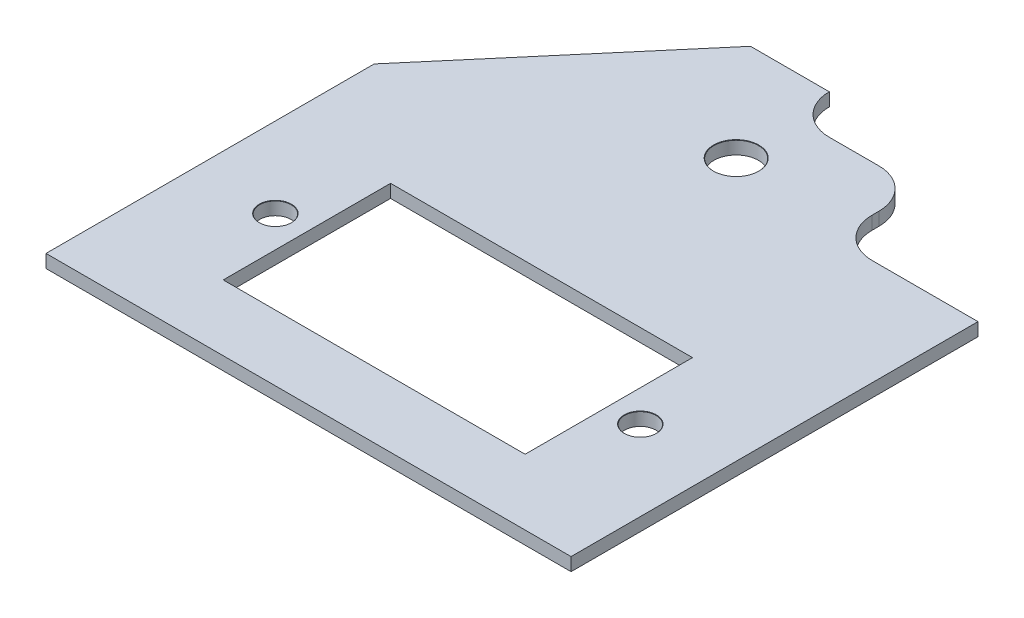
ISO-10303-21;
HEADER;
FILE_DESCRIPTION(('STEP AP214'),'2;1');
FILE_NAME('part.step','',(''),(''),'','','');
FILE_SCHEMA(('AUTOMOTIVE_DESIGN { 1 0 10303 214 1 1 1 1 }'));
ENDSEC;
DATA;
#1=APPLICATION_CONTEXT('core data for automotive mechanical design processes');
#2=APPLICATION_PROTOCOL_DEFINITION('international standard','automotive_design',2000,#1);
#3=PRODUCT_CONTEXT('',#1,'mechanical');
#4=PRODUCT('Part','Part','',(#3));
#5=PRODUCT_RELATED_PRODUCT_CATEGORY('part','',(#4));
#6=PRODUCT_DEFINITION_FORMATION('','',#4);
#7=PRODUCT_DEFINITION_CONTEXT('part definition',#1,'design');
#8=PRODUCT_DEFINITION('design','',#6,#7);
#9=PRODUCT_DEFINITION_SHAPE('','',#8);
#10=(LENGTH_UNIT() NAMED_UNIT(*) SI_UNIT(.MILLI.,.METRE.));
#11=(NAMED_UNIT(*) PLANE_ANGLE_UNIT() SI_UNIT($,.RADIAN.));
#12=(NAMED_UNIT(*) SI_UNIT($,.STERADIAN.) SOLID_ANGLE_UNIT());
#13=UNCERTAINTY_MEASURE_WITH_UNIT(LENGTH_MEASURE(1.E-05),#10,'distance_accuracy_value','');
#14=(GEOMETRIC_REPRESENTATION_CONTEXT(3) GLOBAL_UNCERTAINTY_ASSIGNED_CONTEXT((#13)) GLOBAL_UNIT_ASSIGNED_CONTEXT((#10,
#11,#12)) REPRESENTATION_CONTEXT('',''));
#15=CARTESIAN_POINT('',(0.,0.,0.));
#16=DIRECTION('',(0.,0.,1.));
#17=DIRECTION('',(1.,0.,0.));
#18=AXIS2_PLACEMENT_3D('',#15,#16,#17);
#19=CARTESIAN_POINT('',(9.77,1.,6.5));
#20=DIRECTION('',(0.,1.,0.));
#21=DIRECTION('',(0.,0.,1.));
#22=AXIS2_PLACEMENT_3D('',#19,#20,#21);
#23=PLANE('',#22);
#24=CARTESIAN_POINT('',(-16.0713203435596,1.,29.125));
#25=DIRECTION('',(0.,1.,0.));
#26=DIRECTION('',(0.,0.,1.));
#27=AXIS2_PLACEMENT_3D('',#24,#25,#26);
#28=CIRCLE('',#27,1.225);
#29=CARTESIAN_POINT('',(-16.0713203435596,1.,30.35));
#30=VERTEX_POINT('',#29);
#31=EDGE_CURVE('E430',#30,#30,#28,.T.);
#32=ORIENTED_EDGE('',*,*,#31,.F.);
#33=EDGE_LOOP('',(#32));
#34=FACE_BOUND('',#33,.T.);
#35=CARTESIAN_POINT('',(11.7286796564404,1.,29.125));
#36=DIRECTION('',(0.,1.,0.));
#37=DIRECTION('',(0.,0.,1.));
#38=AXIS2_PLACEMENT_3D('',#35,#36,#37);
#39=CIRCLE('',#38,1.225);
#40=CARTESIAN_POINT('',(11.7286796564404,1.,30.35));
#41=VERTEX_POINT('',#40);
#42=EDGE_CURVE('E418',#41,#41,#39,.T.);
#43=ORIENTED_EDGE('',*,*,#42,.F.);
#44=EDGE_LOOP('',(#43));
#45=FACE_BOUND('',#44,.T.);
#46=CARTESIAN_POINT('',(-2.17132034355964,1.,7.92132034355964));
#47=DIRECTION('',(0.,1.,0.));
#48=DIRECTION('',(0.,0.,1.));
#49=AXIS2_PLACEMENT_3D('',#46,#47,#48);
#50=CIRCLE('',#49,1.725);
#51=CARTESIAN_POINT('',(-2.17132034355964,1.,9.64632034355964));
#52=VERTEX_POINT('',#51);
#53=EDGE_CURVE('E244',#52,#52,#50,.T.);
#54=ORIENTED_EDGE('',*,*,#53,.F.);
#55=EDGE_LOOP('',(#54));
#56=FACE_BOUND('',#55,.T.);
#57=DIRECTION('',(-1.,0.,0.));
#58=VECTOR('',#57,1.);
#59=CARTESIAN_POINT('',(-3.,1.,0.));
#60=LINE('',#59,#58);
#61=CARTESIAN_POINT('',(-3.,1.,0.));
#62=VERTEX_POINT('',#61);
#63=CARTESIAN_POINT('',(-9.,1.,0.));
#64=VERTEX_POINT('',#63);
#65=EDGE_CURVE('E257',#62,#64,#60,.T.);
#66=ORIENTED_EDGE('',*,*,#65,.T.);
#67=DIRECTION('',(-0.64754339017332,0.,0.762028580725713));
#68=VECTOR('',#67,1.);
#69=CARTESIAN_POINT('',(-22.1713203435596,1.,15.5));
#70=LINE('',#69,#68);
#71=CARTESIAN_POINT('',(-22.1713203435596,1.,15.5));
#72=VERTEX_POINT('',#71);
#73=EDGE_CURVE('E195',#64,#72,#70,.T.);
#74=ORIENTED_EDGE('',*,*,#73,.T.);
#75=DIRECTION('',(0.,0.,1.));
#76=VECTOR('',#75,1.);
#77=CARTESIAN_POINT('',(-22.1713203435596,1.,15.5));
#78=LINE('',#77,#76);
#79=CARTESIAN_POINT('',(-22.1713203435596,1.,40.5));
#80=VERTEX_POINT('',#79);
#81=EDGE_CURVE('E214',#72,#80,#78,.T.);
#82=ORIENTED_EDGE('',*,*,#81,.T.);
#83=DIRECTION('',(1.,0.,0.));
#84=VECTOR('',#83,1.);
#85=CARTESIAN_POINT('',(-22.1713203435596,1.,40.5));
#86=LINE('',#85,#84);
#87=CARTESIAN_POINT('',(17.8286796564404,1.,40.5));
#88=VERTEX_POINT('',#87);
#89=EDGE_CURVE('E227',#80,#88,#86,.T.);
#90=ORIENTED_EDGE('',*,*,#89,.T.);
#91=DIRECTION('',(0.,0.,-1.));
#92=VECTOR('',#91,1.);
#93=CARTESIAN_POINT('',(17.8286796564404,1.,40.5));
#94=LINE('',#93,#92);
#95=CARTESIAN_POINT('',(17.8286796564404,1.,9.5));
#96=VERTEX_POINT('',#95);
#97=EDGE_CURVE('E231',#88,#96,#94,.T.);
#98=ORIENTED_EDGE('',*,*,#97,.T.);
#99=DIRECTION('',(-1.,0.,0.));
#100=VECTOR('',#99,1.);
#101=CARTESIAN_POINT('',(9.77,1.,9.5));
#102=LINE('',#101,#100);
#103=CARTESIAN_POINT('',(9.77,1.,9.5));
#104=VERTEX_POINT('',#103);
#105=EDGE_CURVE('E202',#96,#104,#102,.T.);
#106=ORIENTED_EDGE('',*,*,#105,.T.);
#107=CARTESIAN_POINT('',(9.77,1.,6.5));
#108=DIRECTION('',(0.,1.,0.));
#109=DIRECTION('',(0.,0.,1.));
#110=AXIS2_PLACEMENT_3D('',#107,#108,#109);
#111=CIRCLE('',#110,3.);
#112=CARTESIAN_POINT('',(6.77,1.,6.5));
#113=VERTEX_POINT('',#112);
#114=EDGE_CURVE('E261',#113,#104,#111,.T.);
#115=ORIENTED_EDGE('',*,*,#114,.F.);
#116=DIRECTION('',(0.,0.,1.));
#117=VECTOR('',#116,1.);
#118=CARTESIAN_POINT('',(6.77,1.,6.));
#119=LINE('',#118,#117);
#120=CARTESIAN_POINT('',(6.77,1.,6.));
#121=VERTEX_POINT('',#120);
#122=EDGE_CURVE('E266',#121,#113,#119,.T.);
#123=ORIENTED_EDGE('',*,*,#122,.F.);
#124=CARTESIAN_POINT('',(3.77,1.,6.));
#125=DIRECTION('',(0.,1.,0.));
#126=DIRECTION('',(0.,0.,1.));
#127=AXIS2_PLACEMENT_3D('',#124,#125,#126);
#128=CIRCLE('',#127,3.);
#129=CARTESIAN_POINT('',(3.77,1.,3.));
#130=VERTEX_POINT('',#129);
#131=EDGE_CURVE('E270',#121,#130,#128,.T.);
#132=ORIENTED_EDGE('',*,*,#131,.T.);
#133=DIRECTION('',(1.,0.,0.));
#134=VECTOR('',#133,1.);
#135=CARTESIAN_POINT('',(0.,1.,3.));
#136=LINE('',#135,#134);
#137=CARTESIAN_POINT('',(0.,1.,3.));
#138=VERTEX_POINT('',#137);
#139=EDGE_CURVE('E273',#138,#130,#136,.T.);
#140=ORIENTED_EDGE('',*,*,#139,.F.);
#141=CARTESIAN_POINT('',(0.,1.,0.));
#142=DIRECTION('',(0.,1.,0.));
#143=DIRECTION('',(0.,0.,1.));
#144=AXIS2_PLACEMENT_3D('',#141,#142,#143);
#145=CIRCLE('',#144,3.);
#146=EDGE_CURVE('E277',#62,#138,#145,.T.);
#147=ORIENTED_EDGE('',*,*,#146,.F.);
#148=EDGE_LOOP('',(#66,#74,#82,#90,#98,#106,#115,#123,#132,#140,#147));
#149=FACE_BOUND('',#148,.T.);
#150=DIRECTION('',(0.,0.,1.));
#151=VECTOR('',#150,1.);
#152=CARTESIAN_POINT('',(-13.6713203435596,1.,22.75));
#153=LINE('',#152,#151);
#154=CARTESIAN_POINT('',(-13.6713203435596,1.,22.75));
#155=VERTEX_POINT('',#154);
#156=CARTESIAN_POINT('',(-13.6713203435596,1.,35.5));
#157=VERTEX_POINT('',#156);
#158=EDGE_CURVE('E170',#155,#157,#153,.T.);
#159=ORIENTED_EDGE('',*,*,#158,.F.);
#160=DIRECTION('',(1.,0.,0.));
#161=VECTOR('',#160,1.);
#162=CARTESIAN_POINT('',(-13.6713203435596,1.,22.75));
#163=LINE('',#162,#161);
#164=CARTESIAN_POINT('',(9.32867965644035,1.,22.75));
#165=VERTEX_POINT('',#164);
#166=EDGE_CURVE('E57',#155,#165,#163,.T.);
#167=ORIENTED_EDGE('',*,*,#166,.T.);
#168=DIRECTION('',(0.,0.,1.));
#169=VECTOR('',#168,1.);
#170=CARTESIAN_POINT('',(9.32867965644035,1.,22.75));
#171=LINE('',#170,#169);
#172=CARTESIAN_POINT('',(9.32867965644036,1.,35.5));
#173=VERTEX_POINT('',#172);
#174=EDGE_CURVE('E160',#165,#173,#171,.T.);
#175=ORIENTED_EDGE('',*,*,#174,.T.);
#176=DIRECTION('',(1.,0.,0.));
#177=VECTOR('',#176,1.);
#178=CARTESIAN_POINT('',(-13.6713203435596,1.,35.5));
#179=LINE('',#178,#177);
#180=EDGE_CURVE('E167',#157,#173,#179,.T.);
#181=ORIENTED_EDGE('',*,*,#180,.F.);
#182=EDGE_LOOP('',(#159,#167,#175,#181));
#183=FACE_BOUND('',#182,.T.);
#184=ADVANCED_FACE('F41',(#34,#45,#56,#149,#183),#23,.T.);
#185=CARTESIAN_POINT('',(9.77,0.,6.5));
#186=DIRECTION('',(0.,1.,0.));
#187=DIRECTION('',(0.,0.,1.));
#188=AXIS2_PLACEMENT_3D('',#185,#186,#187);
#189=PLANE('',#188);
#190=CARTESIAN_POINT('',(-16.0713203435596,0.,29.125));
#191=DIRECTION('',(0.,1.,0.));
#192=DIRECTION('',(0.,0.,1.));
#193=AXIS2_PLACEMENT_3D('',#190,#191,#192);
#194=CIRCLE('',#193,1.2);
#195=CARTESIAN_POINT('',(-16.0713203435596,0.,30.325));
#196=VERTEX_POINT('',#195);
#197=EDGE_CURVE('E422',#196,#196,#194,.T.);
#198=ORIENTED_EDGE('',*,*,#197,.T.);
#199=EDGE_LOOP('',(#198));
#200=FACE_BOUND('',#199,.T.);
#201=CARTESIAN_POINT('',(11.7286796564404,0.,29.125));
#202=DIRECTION('',(0.,1.,0.));
#203=DIRECTION('',(0.,0.,1.));
#204=AXIS2_PLACEMENT_3D('',#201,#202,#203);
#205=CIRCLE('',#204,1.2);
#206=CARTESIAN_POINT('',(11.7286796564404,0.,30.325));
#207=VERTEX_POINT('',#206);
#208=EDGE_CURVE('E172',#207,#207,#205,.T.);
#209=ORIENTED_EDGE('',*,*,#208,.T.);
#210=EDGE_LOOP('',(#209));
#211=FACE_BOUND('',#210,.T.);
#212=DIRECTION('',(-1.,0.,0.));
#213=VECTOR('',#212,1.);
#214=CARTESIAN_POINT('',(-3.,0.,0.));
#215=LINE('',#214,#213);
#216=CARTESIAN_POINT('',(-3.,0.,0.));
#217=VERTEX_POINT('',#216);
#218=CARTESIAN_POINT('',(-9.,0.,0.));
#219=VERTEX_POINT('',#218);
#220=EDGE_CURVE('E256',#217,#219,#215,.T.);
#221=ORIENTED_EDGE('',*,*,#220,.F.);
#222=CARTESIAN_POINT('',(0.,0.,0.));
#223=DIRECTION('',(0.,1.,0.));
#224=DIRECTION('',(0.,0.,1.));
#225=AXIS2_PLACEMENT_3D('',#222,#223,#224);
#226=CIRCLE('',#225,3.);
#227=CARTESIAN_POINT('',(0.,0.,3.));
#228=VERTEX_POINT('',#227);
#229=EDGE_CURVE('E262',#217,#228,#226,.T.);
#230=ORIENTED_EDGE('',*,*,#229,.T.);
#231=DIRECTION('',(1.,0.,0.));
#232=VECTOR('',#231,1.);
#233=CARTESIAN_POINT('',(0.,0.,3.));
#234=LINE('',#233,#232);
#235=CARTESIAN_POINT('',(3.77,0.,3.));
#236=VERTEX_POINT('',#235);
#237=EDGE_CURVE('E297',#228,#236,#234,.T.);
#238=ORIENTED_EDGE('',*,*,#237,.T.);
#239=CARTESIAN_POINT('',(3.77,0.,6.));
#240=DIRECTION('',(0.,1.,0.));
#241=DIRECTION('',(0.,0.,1.));
#242=AXIS2_PLACEMENT_3D('',#239,#240,#241);
#243=CIRCLE('',#242,3.);
#244=CARTESIAN_POINT('',(6.77,0.,6.));
#245=VERTEX_POINT('',#244);
#246=EDGE_CURVE('E293',#245,#236,#243,.T.);
#247=ORIENTED_EDGE('',*,*,#246,.F.);
#248=DIRECTION('',(0.,0.,1.));
#249=VECTOR('',#248,1.);
#250=CARTESIAN_POINT('',(6.77,0.,6.));
#251=LINE('',#250,#249);
#252=CARTESIAN_POINT('',(6.77,0.,6.5));
#253=VERTEX_POINT('',#252);
#254=EDGE_CURVE('E289',#245,#253,#251,.T.);
#255=ORIENTED_EDGE('',*,*,#254,.T.);
#256=CARTESIAN_POINT('',(9.77,0.,6.5));
#257=DIRECTION('',(0.,1.,0.));
#258=DIRECTION('',(0.,0.,1.));
#259=AXIS2_PLACEMENT_3D('',#256,#257,#258);
#260=CIRCLE('',#259,3.);
#261=CARTESIAN_POINT('',(9.77,0.,9.5));
#262=VERTEX_POINT('',#261);
#263=EDGE_CURVE('E285',#253,#262,#260,.T.);
#264=ORIENTED_EDGE('',*,*,#263,.T.);
#265=DIRECTION('',(1.,0.,0.));
#266=VECTOR('',#265,1.);
#267=CARTESIAN_POINT('',(9.77,0.,9.5));
#268=LINE('',#267,#266);
#269=CARTESIAN_POINT('',(17.8286796564404,0.,9.5));
#270=VERTEX_POINT('',#269);
#271=EDGE_CURVE('E210',#262,#270,#268,.T.);
#272=ORIENTED_EDGE('',*,*,#271,.T.);
#273=DIRECTION('',(0.,0.,1.));
#274=VECTOR('',#273,1.);
#275=CARTESIAN_POINT('',(17.8286796564404,0.,40.5));
#276=LINE('',#275,#274);
#277=CARTESIAN_POINT('',(17.8286796564404,0.,40.5));
#278=VERTEX_POINT('',#277);
#279=EDGE_CURVE('E215',#270,#278,#276,.T.);
#280=ORIENTED_EDGE('',*,*,#279,.T.);
#281=DIRECTION('',(-1.,0.,0.));
#282=VECTOR('',#281,1.);
#283=CARTESIAN_POINT('',(-22.1713203435596,0.,40.5));
#284=LINE('',#283,#282);
#285=CARTESIAN_POINT('',(-22.1713203435596,0.,40.5));
#286=VERTEX_POINT('',#285);
#287=EDGE_CURVE('E223',#278,#286,#284,.T.);
#288=ORIENTED_EDGE('',*,*,#287,.T.);
#289=DIRECTION('',(0.,0.,-1.));
#290=VECTOR('',#289,1.);
#291=CARTESIAN_POINT('',(-22.1713203435596,0.,15.5));
#292=LINE('',#291,#290);
#293=CARTESIAN_POINT('',(-22.1713203435596,0.,15.5));
#294=VERTEX_POINT('',#293);
#295=EDGE_CURVE('E218',#286,#294,#292,.T.);
#296=ORIENTED_EDGE('',*,*,#295,.T.);
#297=DIRECTION('',(0.64754339017332,0.,-0.762028580725713));
#298=VECTOR('',#297,1.);
#299=CARTESIAN_POINT('',(-22.1713203435596,0.,15.5));
#300=LINE('',#299,#298);
#301=EDGE_CURVE('E199',#294,#219,#300,.T.);
#302=ORIENTED_EDGE('',*,*,#301,.T.);
#303=EDGE_LOOP('',(#221,#230,#238,#247,#255,#264,#272,#280,#288,#296,#302));
#304=FACE_BOUND('',#303,.T.);
#305=CARTESIAN_POINT('',(-2.17132034355964,0.,7.92132034355964));
#306=DIRECTION('',(0.,1.,0.));
#307=DIRECTION('',(0.,0.,1.));
#308=AXIS2_PLACEMENT_3D('',#305,#306,#307);
#309=CIRCLE('',#308,1.7);
#310=CARTESIAN_POINT('',(-2.17132034355964,0.,9.62132034355964));
#311=VERTEX_POINT('',#310);
#312=EDGE_CURVE('E252',#311,#311,#309,.T.);
#313=ORIENTED_EDGE('',*,*,#312,.T.);
#314=EDGE_LOOP('',(#313));
#315=FACE_BOUND('',#314,.T.);
#316=DIRECTION('',(-1.,0.,0.));
#317=VECTOR('',#316,1.);
#318=CARTESIAN_POINT('',(-13.6713203435596,0.,22.75));
#319=LINE('',#318,#317);
#320=CARTESIAN_POINT('',(9.32867965644035,0.,22.75));
#321=VERTEX_POINT('',#320);
#322=CARTESIAN_POINT('',(-13.6713203435596,0.,22.75));
#323=VERTEX_POINT('',#322);
#324=EDGE_CURVE('E152',#321,#323,#319,.T.);
#325=ORIENTED_EDGE('',*,*,#324,.T.);
#326=DIRECTION('',(0.,0.,-1.));
#327=VECTOR('',#326,1.);
#328=CARTESIAN_POINT('',(-13.6713203435596,0.,22.75));
#329=LINE('',#328,#327);
#330=CARTESIAN_POINT('',(-13.6713203435596,0.,35.5));
#331=VERTEX_POINT('',#330);
#332=EDGE_CURVE('E192',#331,#323,#329,.T.);
#333=ORIENTED_EDGE('',*,*,#332,.F.);
#334=DIRECTION('',(-1.,0.,0.));
#335=VECTOR('',#334,1.);
#336=CARTESIAN_POINT('',(-13.6713203435596,0.,35.5));
#337=LINE('',#336,#335);
#338=CARTESIAN_POINT('',(9.32867965644036,0.,35.5));
#339=VERTEX_POINT('',#338);
#340=EDGE_CURVE('E156',#339,#331,#337,.T.);
#341=ORIENTED_EDGE('',*,*,#340,.F.);
#342=DIRECTION('',(0.,0.,-1.));
#343=VECTOR('',#342,1.);
#344=CARTESIAN_POINT('',(9.32867965644035,0.,22.75));
#345=LINE('',#344,#343);
#346=EDGE_CURVE('E409',#339,#321,#345,.T.);
#347=ORIENTED_EDGE('',*,*,#346,.T.);
#348=EDGE_LOOP('',(#325,#333,#341,#347));
#349=FACE_BOUND('',#348,.T.);
#350=ADVANCED_FACE('F327',(#200,#211,#304,#315,#349),#189,.F.);
#351=CARTESIAN_POINT('',(-3.,1.,0.));
#352=DIRECTION('',(0.,0.,1.));
#353=DIRECTION('',(1.,0.,0.));
#354=AXIS2_PLACEMENT_3D('',#351,#352,#353);
#355=PLANE('',#354);
#356=ORIENTED_EDGE('',*,*,#220,.T.);
#357=DIRECTION('',(0.,-1.,0.));
#358=VECTOR('',#357,1.);
#359=CARTESIAN_POINT('',(-9.,1.,0.));
#360=LINE('',#359,#358);
#361=EDGE_CURVE('E11',#64,#219,#360,.T.);
#362=ORIENTED_EDGE('',*,*,#361,.F.);
#363=ORIENTED_EDGE('',*,*,#65,.F.);
#364=DIRECTION('',(0.,-1.,0.));
#365=VECTOR('',#364,1.);
#366=CARTESIAN_POINT('',(-3.,1.,0.));
#367=LINE('',#366,#365);
#368=EDGE_CURVE('E281',#62,#217,#367,.T.);
#369=ORIENTED_EDGE('',*,*,#368,.T.);
#370=EDGE_LOOP('',(#356,#362,#363,#369));
#371=FACE_BOUND('',#370,.T.);
#372=ADVANCED_FACE('F43',(#371),#355,.F.);
#373=CARTESIAN_POINT('',(9.77,1.,6.5));
#374=DIRECTION('',(0.,-1.,0.));
#375=DIRECTION('',(0.,0.,-1.));
#376=AXIS2_PLACEMENT_3D('',#373,#374,#375);
#377=CYLINDRICAL_SURFACE('',#376,3.);
#378=ORIENTED_EDGE('',*,*,#263,.F.);
#379=DIRECTION('',(0.,-1.,0.));
#380=VECTOR('',#379,1.);
#381=CARTESIAN_POINT('',(6.77,1.,6.5));
#382=LINE('',#381,#380);
#383=EDGE_CURVE('E315',#113,#253,#382,.T.);
#384=ORIENTED_EDGE('',*,*,#383,.F.);
#385=ORIENTED_EDGE('',*,*,#114,.T.);
#386=DIRECTION('',(0.,-1.,0.));
#387=VECTOR('',#386,1.);
#388=CARTESIAN_POINT('',(9.77,1.,9.5));
#389=LINE('',#388,#387);
#390=EDGE_CURVE('E50',#104,#262,#389,.T.);
#391=ORIENTED_EDGE('',*,*,#390,.T.);
#392=EDGE_LOOP('',(#378,#384,#385,#391));
#393=FACE_BOUND('',#392,.T.);
#394=ADVANCED_FACE('F321',(#393),#377,.F.);
#395=CARTESIAN_POINT('',(6.77,1.,6.));
#396=DIRECTION('',(1.,0.,0.));
#397=DIRECTION('',(0.,0.,-1.));
#398=AXIS2_PLACEMENT_3D('',#395,#396,#397);
#399=PLANE('',#398);
#400=ORIENTED_EDGE('',*,*,#254,.F.);
#401=DIRECTION('',(0.,-1.,0.));
#402=VECTOR('',#401,1.);
#403=CARTESIAN_POINT('',(6.77,1.,6.));
#404=LINE('',#403,#402);
#405=EDGE_CURVE('E312',#121,#245,#404,.T.);
#406=ORIENTED_EDGE('',*,*,#405,.F.);
#407=ORIENTED_EDGE('',*,*,#122,.T.);
#408=ORIENTED_EDGE('',*,*,#383,.T.);
#409=EDGE_LOOP('',(#400,#406,#407,#408));
#410=FACE_BOUND('',#409,.T.);
#411=ADVANCED_FACE('F333',(#410),#399,.T.);
#412=CARTESIAN_POINT('',(3.77,1.,6.));
#413=DIRECTION('',(0.,-1.,0.));
#414=DIRECTION('',(0.,0.,-1.));
#415=AXIS2_PLACEMENT_3D('',#412,#413,#414);
#416=CYLINDRICAL_SURFACE('',#415,3.);
#417=ORIENTED_EDGE('',*,*,#246,.T.);
#418=DIRECTION('',(0.,-1.,0.));
#419=VECTOR('',#418,1.);
#420=CARTESIAN_POINT('',(3.77,1.,3.));
#421=LINE('',#420,#419);
#422=EDGE_CURVE('E309',#130,#236,#421,.T.);
#423=ORIENTED_EDGE('',*,*,#422,.F.);
#424=ORIENTED_EDGE('',*,*,#131,.F.);
#425=ORIENTED_EDGE('',*,*,#405,.T.);
#426=EDGE_LOOP('',(#417,#423,#424,#425));
#427=FACE_BOUND('',#426,.T.);
#428=ADVANCED_FACE('F367',(#427),#416,.T.);
#429=CARTESIAN_POINT('',(0.,1.,3.));
#430=DIRECTION('',(0.,0.,-1.));
#431=DIRECTION('',(-1.,0.,0.));
#432=AXIS2_PLACEMENT_3D('',#429,#430,#431);
#433=PLANE('',#432);
#434=ORIENTED_EDGE('',*,*,#237,.F.);
#435=DIRECTION('',(0.,-1.,0.));
#436=VECTOR('',#435,1.);
#437=CARTESIAN_POINT('',(0.,1.,3.));
#438=LINE('',#437,#436);
#439=EDGE_CURVE('E306',#138,#228,#438,.T.);
#440=ORIENTED_EDGE('',*,*,#439,.F.);
#441=ORIENTED_EDGE('',*,*,#139,.T.);
#442=ORIENTED_EDGE('',*,*,#422,.T.);
#443=EDGE_LOOP('',(#434,#440,#441,#442));
#444=FACE_BOUND('',#443,.T.);
#445=ADVANCED_FACE('F364',(#444),#433,.T.);
#446=CARTESIAN_POINT('',(0.,1.,0.));
#447=DIRECTION('',(0.,-1.,0.));
#448=DIRECTION('',(0.,0.,-1.));
#449=AXIS2_PLACEMENT_3D('',#446,#447,#448);
#450=CYLINDRICAL_SURFACE('',#449,3.);
#451=ORIENTED_EDGE('',*,*,#229,.F.);
#452=ORIENTED_EDGE('',*,*,#368,.F.);
#453=ORIENTED_EDGE('',*,*,#146,.T.);
#454=ORIENTED_EDGE('',*,*,#439,.T.);
#455=EDGE_LOOP('',(#451,#452,#453,#454));
#456=FACE_BOUND('',#455,.T.);
#457=ADVANCED_FACE('F360',(#456),#450,.F.);
#458=CARTESIAN_POINT('',(-2.17132034355964,1.,7.92132034355964));
#459=DIRECTION('',(0.,1.,0.));
#460=DIRECTION('',(0.,0.,1.));
#461=AXIS2_PLACEMENT_3D('',#458,#459,#460);
#462=CYLINDRICAL_SURFACE('',#461,1.7);
#463=ORIENTED_EDGE('',*,*,#312,.F.);
#464=EDGE_LOOP('',(#463));
#465=FACE_BOUND('',#464,.T.);
#466=CARTESIAN_POINT('',(-2.17132034355964,0.974999999999998,7.92132034355964));
#467=DIRECTION('',(0.,1.,0.));
#468=DIRECTION('',(0.,0.,1.));
#469=AXIS2_PLACEMENT_3D('',#466,#467,#468);
#470=CIRCLE('',#469,1.7);
#471=CARTESIAN_POINT('',(-2.17132034355964,0.974999999999998,9.62132034355964));
#472=VERTEX_POINT('',#471);
#473=EDGE_CURVE('E248',#472,#472,#470,.T.);
#474=ORIENTED_EDGE('',*,*,#473,.T.);
#475=EDGE_LOOP('',(#474));
#476=FACE_BOUND('',#475,.T.);
#477=ADVANCED_FACE('F387',(#465,#476),#462,.F.);
#478=CARTESIAN_POINT('',(-2.17132034355964,1.,7.92132034355964));
#479=DIRECTION('',(0.,1.,0.));
#480=DIRECTION('',(0.,0.,1.));
#481=AXIS2_PLACEMENT_3D('',#478,#479,#480);
#482=CONICAL_SURFACE('',#481,1.725,0.785398163397427);
#483=ORIENTED_EDGE('',*,*,#473,.F.);
#484=EDGE_LOOP('',(#483));
#485=FACE_BOUND('',#484,.T.);
#486=ORIENTED_EDGE('',*,*,#53,.T.);
#487=EDGE_LOOP('',(#486));
#488=FACE_BOUND('',#487,.T.);
#489=ADVANCED_FACE('F394',(#485,#488),#482,.F.);
#490=CARTESIAN_POINT('',(-22.1713203435596,-47.169905660283,15.5));
#491=DIRECTION('',(-1.,0.,0.));
#492=DIRECTION('',(0.,0.,1.));
#493=AXIS2_PLACEMENT_3D('',#490,#491,#492);
#494=PLANE('',#493);
#495=ORIENTED_EDGE('',*,*,#295,.F.);
#496=DIRECTION('',(0.,1.,0.));
#497=VECTOR('',#496,1.);
#498=CARTESIAN_POINT('',(-22.1713203435596,-47.169905660283,40.5));
#499=LINE('',#498,#497);
#500=EDGE_CURVE('E234',#286,#80,#499,.T.);
#501=ORIENTED_EDGE('',*,*,#500,.T.);
#502=ORIENTED_EDGE('',*,*,#81,.F.);
#503=DIRECTION('',(0.,1.,0.));
#504=VECTOR('',#503,1.);
#505=CARTESIAN_POINT('',(-22.1713203435596,-47.169905660283,15.5));
#506=LINE('',#505,#504);
#507=EDGE_CURVE('E219',#294,#72,#506,.T.);
#508=ORIENTED_EDGE('',*,*,#507,.F.);
#509=EDGE_LOOP('',(#495,#501,#502,#508));
#510=FACE_BOUND('',#509,.T.);
#511=ADVANCED_FACE('F348',(#510),#494,.T.);
#512=CARTESIAN_POINT('',(17.8286796564404,-47.169905660283,40.5));
#513=DIRECTION('',(1.,0.,0.));
#514=DIRECTION('',(0.,0.,-1.));
#515=AXIS2_PLACEMENT_3D('',#512,#513,#514);
#516=PLANE('',#515);
#517=ORIENTED_EDGE('',*,*,#279,.F.);
#518=DIRECTION('',(0.,1.,0.));
#519=VECTOR('',#518,1.);
#520=CARTESIAN_POINT('',(17.8286796564404,-20.340444429576,9.5));
#521=LINE('',#520,#519);
#522=EDGE_CURVE('E206',#270,#96,#521,.T.);
#523=ORIENTED_EDGE('',*,*,#522,.T.);
#524=ORIENTED_EDGE('',*,*,#97,.F.);
#525=DIRECTION('',(0.,1.,0.));
#526=VECTOR('',#525,1.);
#527=CARTESIAN_POINT('',(17.8286796564404,-47.169905660283,40.5));
#528=LINE('',#527,#526);
#529=EDGE_CURVE('E237',#278,#88,#528,.T.);
#530=ORIENTED_EDGE('',*,*,#529,.F.);
#531=EDGE_LOOP('',(#517,#523,#524,#530));
#532=FACE_BOUND('',#531,.T.);
#533=ADVANCED_FACE('F340',(#532),#516,.T.);
#534=CARTESIAN_POINT('',(-22.1713203435596,-47.169905660283,40.5));
#535=DIRECTION('',(0.,0.,1.));
#536=DIRECTION('',(1.,0.,0.));
#537=AXIS2_PLACEMENT_3D('',#534,#535,#536);
#538=PLANE('',#537);
#539=ORIENTED_EDGE('',*,*,#287,.F.);
#540=ORIENTED_EDGE('',*,*,#529,.T.);
#541=ORIENTED_EDGE('',*,*,#89,.F.);
#542=ORIENTED_EDGE('',*,*,#500,.F.);
#543=EDGE_LOOP('',(#539,#540,#541,#542));
#544=FACE_BOUND('',#543,.T.);
#545=ADVANCED_FACE('F351',(#544),#538,.T.);
#546=CARTESIAN_POINT('',(9.77,-20.340444429576,9.5));
#547=DIRECTION('',(0.,0.,-1.));
#548=DIRECTION('',(-1.,0.,0.));
#549=AXIS2_PLACEMENT_3D('',#546,#547,#548);
#550=PLANE('',#549);
#551=ORIENTED_EDGE('',*,*,#271,.F.);
#552=ORIENTED_EDGE('',*,*,#390,.F.);
#553=ORIENTED_EDGE('',*,*,#105,.F.);
#554=ORIENTED_EDGE('',*,*,#522,.F.);
#555=EDGE_LOOP('',(#551,#552,#553,#554));
#556=FACE_BOUND('',#555,.T.);
#557=ADVANCED_FACE('F338',(#556),#550,.T.);
#558=CARTESIAN_POINT('',(-22.1713203435596,-20.340444429576,15.5));
#559=DIRECTION('',(-0.762028580725713,0.,-0.64754339017332));
#560=DIRECTION('',(-0.64754339017332,0.,0.762028580725713));
#561=AXIS2_PLACEMENT_3D('',#558,#559,#560);
#562=PLANE('',#561);
#563=ORIENTED_EDGE('',*,*,#301,.F.);
#564=ORIENTED_EDGE('',*,*,#507,.T.);
#565=ORIENTED_EDGE('',*,*,#73,.F.);
#566=ORIENTED_EDGE('',*,*,#361,.T.);
#567=EDGE_LOOP('',(#563,#564,#565,#566));
#568=FACE_BOUND('',#567,.T.);
#569=ADVANCED_FACE('F356',(#568),#562,.T.);
#570=CARTESIAN_POINT('',(-13.6713203435596,-26.2975759339145,22.75));
#571=DIRECTION('',(0.,0.,1.));
#572=DIRECTION('',(1.,0.,0.));
#573=AXIS2_PLACEMENT_3D('',#570,#571,#572);
#574=PLANE('',#573);
#575=DIRECTION('',(0.,1.,0.));
#576=VECTOR('',#575,1.);
#577=CARTESIAN_POINT('',(9.32867965644035,-26.2975759339145,22.75));
#578=LINE('',#577,#576);
#579=EDGE_CURVE('E148',#321,#165,#578,.T.);
#580=ORIENTED_EDGE('',*,*,#579,.T.);
#581=ORIENTED_EDGE('',*,*,#166,.F.);
#582=DIRECTION('',(0.,1.,0.));
#583=VECTOR('',#582,1.);
#584=CARTESIAN_POINT('',(-13.6713203435596,-26.2975759339145,22.75));
#585=LINE('',#584,#583);
#586=EDGE_CURVE('E185',#323,#155,#585,.T.);
#587=ORIENTED_EDGE('',*,*,#586,.F.);
#588=ORIENTED_EDGE('',*,*,#324,.F.);
#589=EDGE_LOOP('',(#580,#581,#587,#588));
#590=FACE_BOUND('',#589,.T.);
#591=ADVANCED_FACE('F150',(#590),#574,.T.);
#592=CARTESIAN_POINT('',(9.32867965644035,-26.2975759339145,22.75));
#593=DIRECTION('',(-1.,0.,0.));
#594=DIRECTION('',(0.,0.,1.));
#595=AXIS2_PLACEMENT_3D('',#592,#593,#594);
#596=PLANE('',#595);
#597=DIRECTION('',(0.,1.,0.));
#598=VECTOR('',#597,1.);
#599=CARTESIAN_POINT('',(9.32867965644036,-26.2975759339145,35.5));
#600=LINE('',#599,#598);
#601=EDGE_CURVE('E157',#339,#173,#600,.T.);
#602=ORIENTED_EDGE('',*,*,#601,.T.);
#603=ORIENTED_EDGE('',*,*,#174,.F.);
#604=ORIENTED_EDGE('',*,*,#579,.F.);
#605=ORIENTED_EDGE('',*,*,#346,.F.);
#606=EDGE_LOOP('',(#602,#603,#604,#605));
#607=FACE_BOUND('',#606,.T.);
#608=ADVANCED_FACE('F161',(#607),#596,.T.);
#609=CARTESIAN_POINT('',(-13.6713203435596,-26.2975759339145,35.5));
#610=DIRECTION('',(0.,0.,1.));
#611=DIRECTION('',(1.,0.,0.));
#612=AXIS2_PLACEMENT_3D('',#609,#610,#611);
#613=PLANE('',#612);
#614=ORIENTED_EDGE('',*,*,#340,.T.);
#615=DIRECTION('',(0.,1.,0.));
#616=VECTOR('',#615,1.);
#617=CARTESIAN_POINT('',(-13.6713203435596,-26.2975759339145,35.5));
#618=LINE('',#617,#616);
#619=EDGE_CURVE('E65',#331,#157,#618,.T.);
#620=ORIENTED_EDGE('',*,*,#619,.T.);
#621=ORIENTED_EDGE('',*,*,#180,.T.);
#622=ORIENTED_EDGE('',*,*,#601,.F.);
#623=EDGE_LOOP('',(#614,#620,#621,#622));
#624=FACE_BOUND('',#623,.T.);
#625=ADVANCED_FACE('F457',(#624),#613,.F.);
#626=CARTESIAN_POINT('',(-13.6713203435596,-26.2975759339145,22.75));
#627=DIRECTION('',(-1.,0.,0.));
#628=DIRECTION('',(0.,0.,1.));
#629=AXIS2_PLACEMENT_3D('',#626,#627,#628);
#630=PLANE('',#629);
#631=ORIENTED_EDGE('',*,*,#332,.T.);
#632=ORIENTED_EDGE('',*,*,#586,.T.);
#633=ORIENTED_EDGE('',*,*,#158,.T.);
#634=ORIENTED_EDGE('',*,*,#619,.F.);
#635=EDGE_LOOP('',(#631,#632,#633,#634));
#636=FACE_BOUND('',#635,.T.);
#637=ADVANCED_FACE('F453',(#636),#630,.F.);
#638=CARTESIAN_POINT('',(11.7286796564404,1.,29.125));
#639=DIRECTION('',(0.,1.,0.));
#640=DIRECTION('',(0.,0.,1.));
#641=AXIS2_PLACEMENT_3D('',#638,#639,#640);
#642=CYLINDRICAL_SURFACE('',#641,1.2);
#643=ORIENTED_EDGE('',*,*,#208,.F.);
#644=EDGE_LOOP('',(#643));
#645=FACE_BOUND('',#644,.T.);
#646=CARTESIAN_POINT('',(11.7286796564404,0.974999999999999,29.125));
#647=DIRECTION('',(0.,1.,0.));
#648=DIRECTION('',(0.,0.,1.));
#649=AXIS2_PLACEMENT_3D('',#646,#647,#648);
#650=CIRCLE('',#649,1.2);
#651=CARTESIAN_POINT('',(11.7286796564404,0.974999999999999,30.325));
#652=VERTEX_POINT('',#651);
#653=EDGE_CURVE('E176',#652,#652,#650,.T.);
#654=ORIENTED_EDGE('',*,*,#653,.T.);
#655=EDGE_LOOP('',(#654));
#656=FACE_BOUND('',#655,.T.);
#657=ADVANCED_FACE('F449',(#645,#656),#642,.F.);
#658=CARTESIAN_POINT('',(11.7286796564404,1.,29.125));
#659=DIRECTION('',(0.,1.,0.));
#660=DIRECTION('',(0.,0.,1.));
#661=AXIS2_PLACEMENT_3D('',#658,#659,#660);
#662=CONICAL_SURFACE('',#661,1.225,0.785398163397414);
#663=ORIENTED_EDGE('',*,*,#653,.F.);
#664=EDGE_LOOP('',(#663));
#665=FACE_BOUND('',#664,.T.);
#666=ORIENTED_EDGE('',*,*,#42,.T.);
#667=EDGE_LOOP('',(#666));
#668=FACE_BOUND('',#667,.T.);
#669=ADVANCED_FACE('F442',(#665,#668),#662,.F.);
#670=CARTESIAN_POINT('',(-16.0713203435596,1.,29.125));
#671=DIRECTION('',(0.,1.,0.));
#672=DIRECTION('',(0.,0.,1.));
#673=AXIS2_PLACEMENT_3D('',#670,#671,#672);
#674=CYLINDRICAL_SURFACE('',#673,1.2);
#675=ORIENTED_EDGE('',*,*,#197,.F.);
#676=EDGE_LOOP('',(#675));
#677=FACE_BOUND('',#676,.T.);
#678=CARTESIAN_POINT('',(-16.0713203435596,0.974999999999999,29.125));
#679=DIRECTION('',(0.,1.,0.));
#680=DIRECTION('',(0.,0.,1.));
#681=AXIS2_PLACEMENT_3D('',#678,#679,#680);
#682=CIRCLE('',#681,1.2);
#683=CARTESIAN_POINT('',(-16.0713203435596,0.974999999999999,30.325));
#684=VERTEX_POINT('',#683);
#685=EDGE_CURVE('E426',#684,#684,#682,.T.);
#686=ORIENTED_EDGE('',*,*,#685,.T.);
#687=EDGE_LOOP('',(#686));
#688=FACE_BOUND('',#687,.T.);
#689=ADVANCED_FACE('F436',(#677,#688),#674,.F.);
#690=CARTESIAN_POINT('',(-16.0713203435596,1.,29.125));
#691=DIRECTION('',(0.,1.,0.));
#692=DIRECTION('',(0.,0.,1.));
#693=AXIS2_PLACEMENT_3D('',#690,#691,#692);
#694=CONICAL_SURFACE('',#693,1.225,0.785398163397414);
#695=ORIENTED_EDGE('',*,*,#685,.F.);
#696=EDGE_LOOP('',(#695));
#697=FACE_BOUND('',#696,.T.);
#698=ORIENTED_EDGE('',*,*,#31,.T.);
#699=EDGE_LOOP('',(#698));
#700=FACE_BOUND('',#699,.T.);
#701=ADVANCED_FACE('F434',(#697,#700),#694,.F.);
#702=CLOSED_SHELL('',(#184,#350,#372,#394,#411,#428,#445,#457,#477,#489,#511,#533,#545,#557,
#569,#591,#608,#625,#637,#657,#669,#689,#701));
#703=MANIFOLD_SOLID_BREP('B2',#702);
#704=ADVANCED_BREP_SHAPE_REPRESENTATION('',(#18,#703),#14);
#705=SHAPE_DEFINITION_REPRESENTATION(#9,#704);
ENDSEC;
END-ISO-10303-21;
